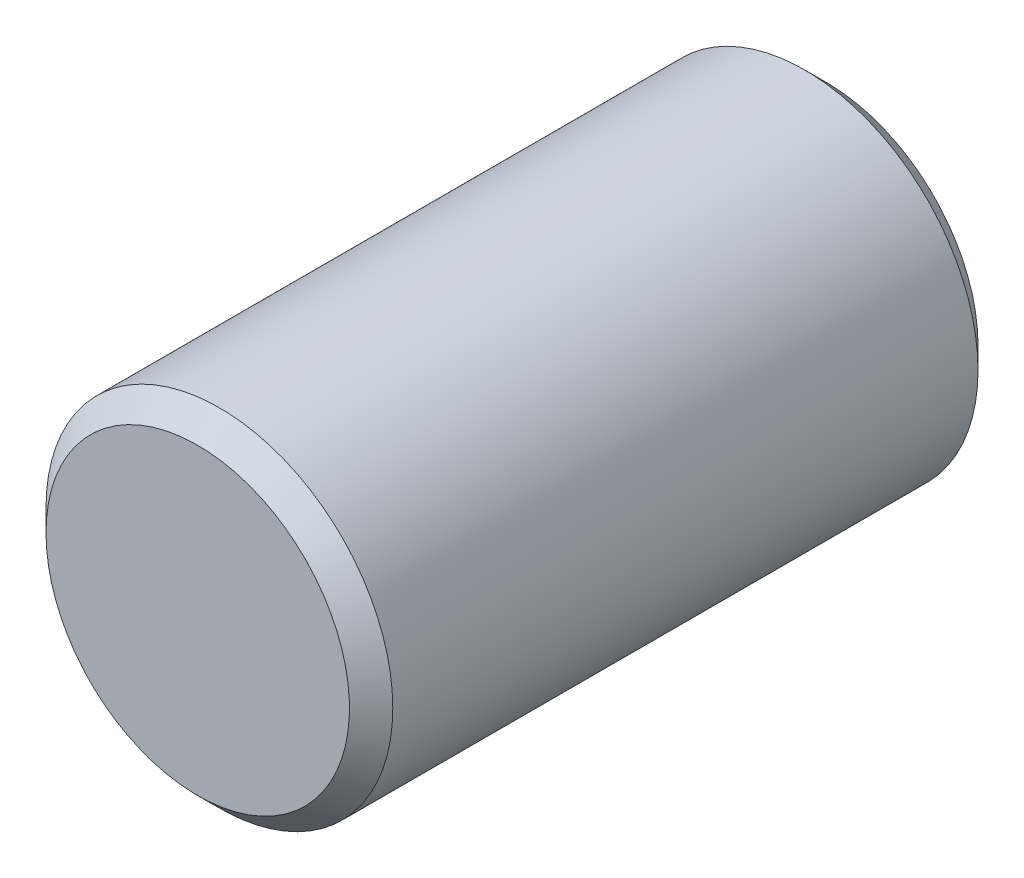
ISO-10303-21;
HEADER;
FILE_DESCRIPTION(('STEP AP214'),'2;1');
FILE_NAME('part.step','',(''),(''),'','','');
FILE_SCHEMA(('AUTOMOTIVE_DESIGN { 1 0 10303 214 1 1 1 1 }'));
ENDSEC;
DATA;
#1=APPLICATION_CONTEXT('core data for automotive mechanical design processes');
#2=APPLICATION_PROTOCOL_DEFINITION('international standard','automotive_design',2000,#1);
#3=PRODUCT_CONTEXT('',#1,'mechanical');
#4=PRODUCT('Part','Part','',(#3));
#5=PRODUCT_RELATED_PRODUCT_CATEGORY('part','',(#4));
#6=PRODUCT_DEFINITION_FORMATION('','',#4);
#7=PRODUCT_DEFINITION_CONTEXT('part definition',#1,'design');
#8=PRODUCT_DEFINITION('design','',#6,#7);
#9=PRODUCT_DEFINITION_SHAPE('','',#8);
#10=(LENGTH_UNIT() NAMED_UNIT(*) SI_UNIT(.MILLI.,.METRE.));
#11=(NAMED_UNIT(*) PLANE_ANGLE_UNIT() SI_UNIT($,.RADIAN.));
#12=(NAMED_UNIT(*) SI_UNIT($,.STERADIAN.) SOLID_ANGLE_UNIT());
#13=UNCERTAINTY_MEASURE_WITH_UNIT(LENGTH_MEASURE(1.E-05),#10,'distance_accuracy_value','');
#14=(GEOMETRIC_REPRESENTATION_CONTEXT(3) GLOBAL_UNCERTAINTY_ASSIGNED_CONTEXT((#13)) GLOBAL_UNIT_ASSIGNED_CONTEXT((#10,
#11,#12)) REPRESENTATION_CONTEXT('',''));
#15=CARTESIAN_POINT('',(0.,0.,0.));
#16=DIRECTION('',(0.,0.,1.));
#17=DIRECTION('',(1.,0.,0.));
#18=AXIS2_PLACEMENT_3D('',#15,#16,#17);
#19=CARTESIAN_POINT('',(0.,0.,0.));
#20=DIRECTION('',(0.,0.,-1.));
#21=DIRECTION('',(-1.,0.,0.));
#22=AXIS2_PLACEMENT_3D('',#19,#20,#21);
#23=PLANE('',#22);
#24=CARTESIAN_POINT('',(0.,0.,0.));
#25=DIRECTION('',(0.,0.,-1.));
#26=DIRECTION('',(-1.,0.,0.));
#27=AXIS2_PLACEMENT_3D('',#24,#25,#26);
#28=CIRCLE('',#27,3.49999999999999);
#29=CARTESIAN_POINT('',(-3.49999999999999,0.,0.));
#30=VERTEX_POINT('',#29);
#31=EDGE_CURVE('E10',#30,#30,#28,.F.);
#32=ORIENTED_EDGE('',*,*,#31,.T.);
#33=EDGE_LOOP('',(#32));
#34=FACE_BOUND('',#33,.T.);
#35=ADVANCED_FACE('F37',(#34),#23,.F.);
#36=CARTESIAN_POINT('',(0.,0.,0.));
#37=DIRECTION('',(0.,0.,1.));
#38=DIRECTION('',(1.,0.,0.));
#39=AXIS2_PLACEMENT_3D('',#36,#37,#38);
#40=CYLINDRICAL_SURFACE('',#39,4.);
#41=CARTESIAN_POINT('',(0.,0.,-14.));
#42=DIRECTION('',(0.,0.,1.));
#43=DIRECTION('',(1.,0.,0.));
#44=AXIS2_PLACEMENT_3D('',#41,#42,#43);
#45=CIRCLE('',#44,4.);
#46=CARTESIAN_POINT('',(4.,0.,-14.));
#47=VERTEX_POINT('',#46);
#48=EDGE_CURVE('E50',#47,#47,#45,.T.);
#49=ORIENTED_EDGE('',*,*,#48,.T.);
#50=EDGE_LOOP('',(#49));
#51=FACE_BOUND('',#50,.T.);
#52=CARTESIAN_POINT('',(0.,0.,-0.500000000000008));
#53=DIRECTION('',(0.,0.,-1.));
#54=DIRECTION('',(-1.,0.,0.));
#55=AXIS2_PLACEMENT_3D('',#52,#53,#54);
#56=CIRCLE('',#55,4.);
#57=CARTESIAN_POINT('',(-4.,0.,-0.500000000000008));
#58=VERTEX_POINT('',#57);
#59=EDGE_CURVE('E55',#58,#58,#56,.T.);
#60=ORIENTED_EDGE('',*,*,#59,.T.);
#61=EDGE_LOOP('',(#60));
#62=FACE_BOUND('',#61,.T.);
#63=ADVANCED_FACE('F62',(#51,#62),#40,.T.);
#64=CARTESIAN_POINT('',(0.,0.,-14.5));
#65=DIRECTION('',(0.,0.,1.));
#66=DIRECTION('',(1.,0.,0.));
#67=AXIS2_PLACEMENT_3D('',#64,#65,#66);
#68=PLANE('',#67);
#69=CARTESIAN_POINT('',(0.,0.,-14.5));
#70=DIRECTION('',(0.,0.,1.));
#71=DIRECTION('',(1.,0.,0.));
#72=AXIS2_PLACEMENT_3D('',#69,#70,#71);
#73=CIRCLE('',#72,3.5);
#74=CARTESIAN_POINT('',(3.5,0.,-14.5));
#75=VERTEX_POINT('',#74);
#76=EDGE_CURVE('E45',#75,#75,#73,.F.);
#77=ORIENTED_EDGE('',*,*,#76,.T.);
#78=EDGE_LOOP('',(#77));
#79=FACE_BOUND('',#78,.T.);
#80=ADVANCED_FACE('F70',(#79),#68,.F.);
#81=CARTESIAN_POINT('',(0.,0.,-14.));
#82=DIRECTION('',(0.,0.,1.));
#83=DIRECTION('',(1.,0.,0.));
#84=AXIS2_PLACEMENT_3D('',#81,#82,#83);
#85=CONICAL_SURFACE('',#84,4.,0.785398163397452);
#86=ORIENTED_EDGE('',*,*,#76,.F.);
#87=EDGE_LOOP('',(#86));
#88=FACE_BOUND('',#87,.T.);
#89=ORIENTED_EDGE('',*,*,#48,.F.);
#90=EDGE_LOOP('',(#89));
#91=FACE_BOUND('',#90,.T.);
#92=ADVANCED_FACE('F66',(#88,#91),#85,.T.);
#93=CARTESIAN_POINT('',(0.,0.,0.));
#94=DIRECTION('',(0.,0.,-1.));
#95=DIRECTION('',(-1.,0.,0.));
#96=AXIS2_PLACEMENT_3D('',#93,#94,#95);
#97=CONICAL_SURFACE('',#96,3.49999999999999,0.785398163397447);
#98=ORIENTED_EDGE('',*,*,#59,.F.);
#99=EDGE_LOOP('',(#98));
#100=FACE_BOUND('',#99,.T.);
#101=ORIENTED_EDGE('',*,*,#31,.F.);
#102=EDGE_LOOP('',(#101));
#103=FACE_BOUND('',#102,.T.);
#104=ADVANCED_FACE('F39',(#100,#103),#97,.T.);
#105=CLOSED_SHELL('',(#35,#63,#80,#92,#104));
#106=MANIFOLD_SOLID_BREP('B2',#105);
#107=ADVANCED_BREP_SHAPE_REPRESENTATION('',(#18,#106),#14);
#108=SHAPE_DEFINITION_REPRESENTATION(#9,#107);
ENDSEC;
END-ISO-10303-21;
